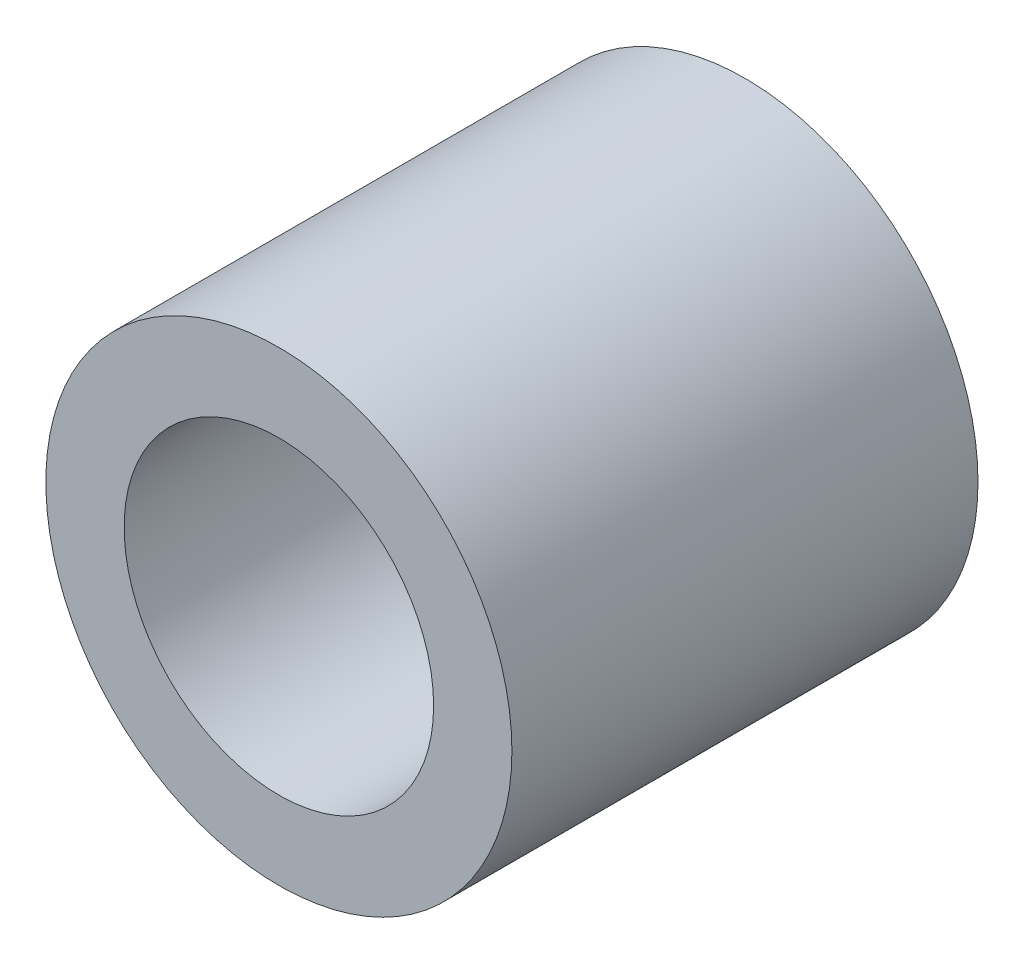
ISO-10303-21;
HEADER;
FILE_DESCRIPTION(('STEP AP214'),'2;1');
FILE_NAME('part.step','',(''),(''),'','','');
FILE_SCHEMA(('AUTOMOTIVE_DESIGN { 1 0 10303 214 1 1 1 1 }'));
ENDSEC;
DATA;
#1=APPLICATION_CONTEXT('core data for automotive mechanical design processes');
#2=APPLICATION_PROTOCOL_DEFINITION('international standard','automotive_design',2000,#1);
#3=PRODUCT_CONTEXT('',#1,'mechanical');
#4=PRODUCT('Part','Part','',(#3));
#5=PRODUCT_RELATED_PRODUCT_CATEGORY('part','',(#4));
#6=PRODUCT_DEFINITION_FORMATION('','',#4);
#7=PRODUCT_DEFINITION_CONTEXT('part definition',#1,'design');
#8=PRODUCT_DEFINITION('design','',#6,#7);
#9=PRODUCT_DEFINITION_SHAPE('','',#8);
#10=(LENGTH_UNIT() NAMED_UNIT(*) SI_UNIT(.MILLI.,.METRE.));
#11=(NAMED_UNIT(*) PLANE_ANGLE_UNIT() SI_UNIT($,.RADIAN.));
#12=(NAMED_UNIT(*) SI_UNIT($,.STERADIAN.) SOLID_ANGLE_UNIT());
#13=UNCERTAINTY_MEASURE_WITH_UNIT(LENGTH_MEASURE(1.E-05),#10,'distance_accuracy_value','');
#14=(GEOMETRIC_REPRESENTATION_CONTEXT(3) GLOBAL_UNCERTAINTY_ASSIGNED_CONTEXT((#13)) GLOBAL_UNIT_ASSIGNED_CONTEXT((#10,
#11,#12)) REPRESENTATION_CONTEXT('',''));
#15=CARTESIAN_POINT('',(0.,0.,0.));
#16=DIRECTION('',(0.,0.,1.));
#17=DIRECTION('',(1.,0.,0.));
#18=AXIS2_PLACEMENT_3D('',#15,#16,#17);
#19=CARTESIAN_POINT('',(0.,3.175,3.175));
#20=DIRECTION('',(0.,0.,-1.));
#21=DIRECTION('',(-1.,0.,0.));
#22=AXIS2_PLACEMENT_3D('',#19,#20,#21);
#23=PLANE('',#22);
#24=CARTESIAN_POINT('',(0.,0.,3.175));
#25=DIRECTION('',(0.,0.,1.));
#26=DIRECTION('',(1.,0.,0.));
#27=AXIS2_PLACEMENT_3D('',#24,#25,#26);
#28=CIRCLE('',#27,2.1082);
#29=CARTESIAN_POINT('',(2.1082,0.,3.175));
#30=VERTEX_POINT('',#29);
#31=EDGE_CURVE('E10',#30,#30,#28,.T.);
#32=ORIENTED_EDGE('',*,*,#31,.F.);
#33=EDGE_LOOP('',(#32));
#34=FACE_BOUND('',#33,.T.);
#35=CARTESIAN_POINT('',(0.,0.,3.175));
#36=DIRECTION('',(0.,0.,1.));
#37=DIRECTION('',(1.,0.,0.));
#38=AXIS2_PLACEMENT_3D('',#35,#36,#37);
#39=CIRCLE('',#38,3.175);
#40=CARTESIAN_POINT('',(3.175,0.,3.175));
#41=VERTEX_POINT('',#40);
#42=EDGE_CURVE('E54',#41,#41,#39,.T.);
#43=ORIENTED_EDGE('',*,*,#42,.T.);
#44=EDGE_LOOP('',(#43));
#45=FACE_BOUND('',#44,.T.);
#46=ADVANCED_FACE('F33',(#34,#45),#23,.F.);
#47=CARTESIAN_POINT('',(0.,0.,43.4651844186562));
#48=DIRECTION('',(0.,0.,1.));
#49=DIRECTION('',(1.,0.,0.));
#50=AXIS2_PLACEMENT_3D('',#47,#48,#49);
#51=CYLINDRICAL_SURFACE('',#50,2.1082);
#52=CARTESIAN_POINT('',(0.,0.,-3.175));
#53=DIRECTION('',(0.,0.,1.));
#54=DIRECTION('',(1.,0.,0.));
#55=AXIS2_PLACEMENT_3D('',#52,#53,#54);
#56=CIRCLE('',#55,2.1082);
#57=CARTESIAN_POINT('',(2.1082,0.,-3.175));
#58=VERTEX_POINT('',#57);
#59=EDGE_CURVE('E40',#58,#58,#56,.T.);
#60=ORIENTED_EDGE('',*,*,#59,.F.);
#61=EDGE_LOOP('',(#60));
#62=FACE_BOUND('',#61,.T.);
#63=ORIENTED_EDGE('',*,*,#31,.T.);
#64=EDGE_LOOP('',(#63));
#65=FACE_BOUND('',#64,.T.);
#66=ADVANCED_FACE('F72',(#62,#65),#51,.F.);
#67=CARTESIAN_POINT('',(0.,3.175,-3.175));
#68=DIRECTION('',(0.,0.,1.));
#69=DIRECTION('',(1.,0.,0.));
#70=AXIS2_PLACEMENT_3D('',#67,#68,#69);
#71=PLANE('',#70);
#72=CARTESIAN_POINT('',(0.,0.,-3.175));
#73=DIRECTION('',(0.,0.,1.));
#74=DIRECTION('',(1.,0.,0.));
#75=AXIS2_PLACEMENT_3D('',#72,#73,#74);
#76=CIRCLE('',#75,3.175);
#77=CARTESIAN_POINT('',(3.175,0.,-3.175));
#78=VERTEX_POINT('',#77);
#79=EDGE_CURVE('E47',#78,#78,#76,.T.);
#80=ORIENTED_EDGE('',*,*,#79,.F.);
#81=EDGE_LOOP('',(#80));
#82=FACE_BOUND('',#81,.T.);
#83=ORIENTED_EDGE('',*,*,#59,.T.);
#84=EDGE_LOOP('',(#83));
#85=FACE_BOUND('',#84,.T.);
#86=ADVANCED_FACE('F67',(#82,#85),#71,.F.);
#87=CARTESIAN_POINT('',(0.,0.,43.4651844186562));
#88=DIRECTION('',(0.,0.,1.));
#89=DIRECTION('',(1.,0.,0.));
#90=AXIS2_PLACEMENT_3D('',#87,#88,#89);
#91=CYLINDRICAL_SURFACE('',#90,3.175);
#92=ORIENTED_EDGE('',*,*,#42,.F.);
#93=EDGE_LOOP('',(#92));
#94=FACE_BOUND('',#93,.T.);
#95=ORIENTED_EDGE('',*,*,#79,.T.);
#96=EDGE_LOOP('',(#95));
#97=FACE_BOUND('',#96,.T.);
#98=ADVANCED_FACE('F64',(#94,#97),#91,.T.);
#99=CLOSED_SHELL('',(#46,#66,#86,#98));
#100=MANIFOLD_SOLID_BREP('B2',#99);
#101=ADVANCED_BREP_SHAPE_REPRESENTATION('',(#18,#100),#14);
#102=SHAPE_DEFINITION_REPRESENTATION(#9,#101);
ENDSEC;
END-ISO-10303-21;
